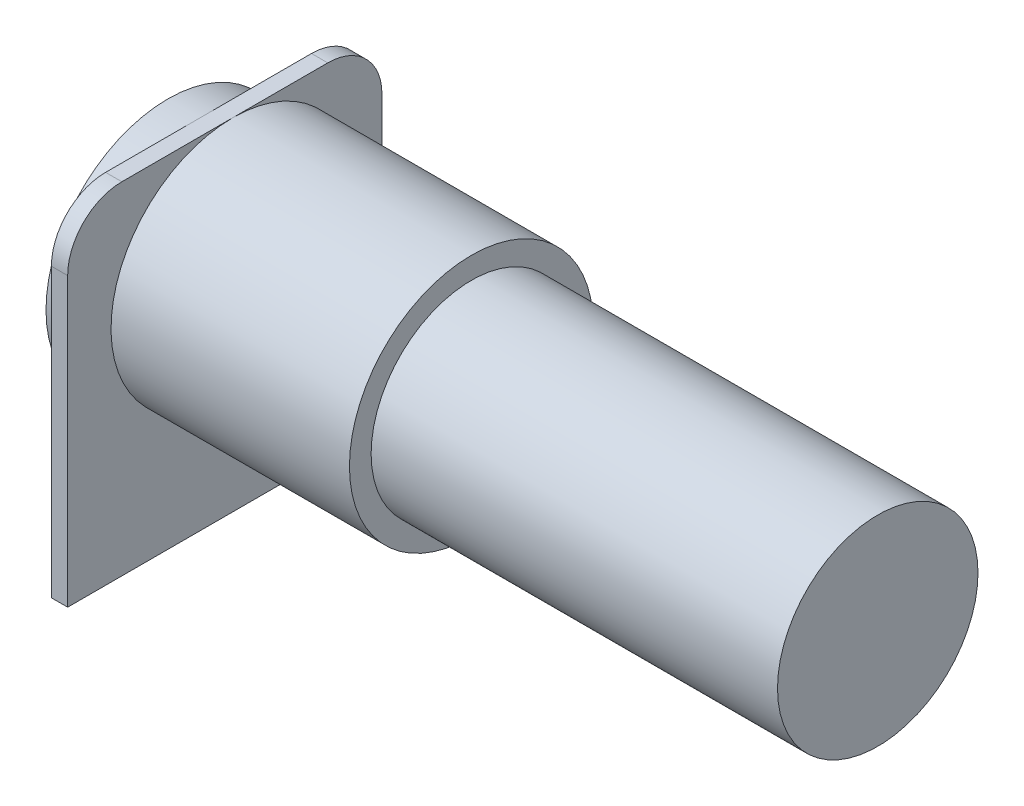
ISO-10303-21;
HEADER;
FILE_DESCRIPTION(('STEP AP214'),'2;1');
FILE_NAME('part.step','',(''),(''),'','','');
FILE_SCHEMA(('AUTOMOTIVE_DESIGN { 1 0 10303 214 1 1 1 1 }'));
ENDSEC;
DATA;
#1=APPLICATION_CONTEXT('core data for automotive mechanical design processes');
#2=APPLICATION_PROTOCOL_DEFINITION('international standard','automotive_design',2000,#1);
#3=PRODUCT_CONTEXT('',#1,'mechanical');
#4=PRODUCT('Part','Part','',(#3));
#5=PRODUCT_RELATED_PRODUCT_CATEGORY('part','',(#4));
#6=PRODUCT_DEFINITION_FORMATION('','',#4);
#7=PRODUCT_DEFINITION_CONTEXT('part definition',#1,'design');
#8=PRODUCT_DEFINITION('design','',#6,#7);
#9=PRODUCT_DEFINITION_SHAPE('','',#8);
#10=(LENGTH_UNIT() NAMED_UNIT(*) SI_UNIT(.MILLI.,.METRE.));
#11=(NAMED_UNIT(*) PLANE_ANGLE_UNIT() SI_UNIT($,.RADIAN.));
#12=(NAMED_UNIT(*) SI_UNIT($,.STERADIAN.) SOLID_ANGLE_UNIT());
#13=UNCERTAINTY_MEASURE_WITH_UNIT(LENGTH_MEASURE(1.E-05),#10,'distance_accuracy_value','');
#14=(GEOMETRIC_REPRESENTATION_CONTEXT(3) GLOBAL_UNCERTAINTY_ASSIGNED_CONTEXT((#13)) GLOBAL_UNIT_ASSIGNED_CONTEXT((#10,
#11,#12)) REPRESENTATION_CONTEXT('',''));
#15=CARTESIAN_POINT('',(0.,0.,0.));
#16=DIRECTION('',(0.,0.,1.));
#17=DIRECTION('',(1.,0.,0.));
#18=AXIS2_PLACEMENT_3D('',#15,#16,#17);
#19=CARTESIAN_POINT('',(3.,-11.2224824355973,58.));
#20=DIRECTION('',(0.,0.,-1.));
#21=DIRECTION('',(0.,1.,0.));
#22=AXIS2_PLACEMENT_3D('',#19,#20,#21);
#23=PLANE('',#22);
#24=DIRECTION('',(0.,-1.,0.));
#25=VECTOR('',#24,1.);
#26=CARTESIAN_POINT('',(0.,-11.2224824355973,58.));
#27=LINE('',#26,#25);
#28=CARTESIAN_POINT('',(0.,-11.2224824355973,58.));
#29=VERTEX_POINT('',#28);
#30=CARTESIAN_POINT('',(0.,-64.2224824355972,58.));
#31=VERTEX_POINT('',#30);
#32=EDGE_CURVE('E140',#29,#31,#27,.T.);
#33=ORIENTED_EDGE('',*,*,#32,.T.);
#34=DIRECTION('',(-1.,0.,0.));
#35=VECTOR('',#34,1.);
#36=CARTESIAN_POINT('',(3.,-64.2224824355972,58.));
#37=LINE('',#36,#35);
#38=CARTESIAN_POINT('',(3.,-64.2224824355972,58.));
#39=VERTEX_POINT('',#38);
#40=EDGE_CURVE('E42',#39,#31,#37,.T.);
#41=ORIENTED_EDGE('',*,*,#40,.F.);
#42=DIRECTION('',(0.,-1.,0.));
#43=VECTOR('',#42,1.);
#44=CARTESIAN_POINT('',(3.,-11.2224824355973,58.));
#45=LINE('',#44,#43);
#46=CARTESIAN_POINT('',(3.,-11.2224824355973,58.));
#47=VERTEX_POINT('',#46);
#48=EDGE_CURVE('E158',#47,#39,#45,.T.);
#49=ORIENTED_EDGE('',*,*,#48,.F.);
#50=DIRECTION('',(-1.,0.,0.));
#51=VECTOR('',#50,1.);
#52=CARTESIAN_POINT('',(3.,-11.2224824355973,58.));
#53=LINE('',#52,#51);
#54=EDGE_CURVE('E136',#47,#29,#53,.T.);
#55=ORIENTED_EDGE('',*,*,#54,.T.);
#56=EDGE_LOOP('',(#33,#41,#49,#55));
#57=FACE_BOUND('',#56,.T.);
#58=ADVANCED_FACE('F39',(#57),#23,.F.);
#59=CARTESIAN_POINT('',(3.,-64.2224824355972,0.));
#60=DIRECTION('',(0.,1.,0.));
#61=DIRECTION('',(0.,0.,1.));
#62=AXIS2_PLACEMENT_3D('',#59,#60,#61);
#63=PLANE('',#62);
#64=DIRECTION('',(0.,0.,-1.));
#65=VECTOR('',#64,1.);
#66=CARTESIAN_POINT('',(0.,-64.2224824355972,0.));
#67=LINE('',#66,#65);
#68=CARTESIAN_POINT('',(0.,-64.2224824355972,0.));
#69=VERTEX_POINT('',#68);
#70=EDGE_CURVE('E144',#31,#69,#67,.T.);
#71=ORIENTED_EDGE('',*,*,#70,.T.);
#72=DIRECTION('',(-1.,0.,0.));
#73=VECTOR('',#72,1.);
#74=CARTESIAN_POINT('',(3.,-64.2224824355972,0.));
#75=LINE('',#74,#73);
#76=CARTESIAN_POINT('',(3.,-64.2224824355972,0.));
#77=VERTEX_POINT('',#76);
#78=EDGE_CURVE('E164',#77,#69,#75,.T.);
#79=ORIENTED_EDGE('',*,*,#78,.F.);
#80=DIRECTION('',(0.,0.,-1.));
#81=VECTOR('',#80,1.);
#82=CARTESIAN_POINT('',(3.,-64.2224824355972,0.));
#83=LINE('',#82,#81);
#84=EDGE_CURVE('E96',#39,#77,#83,.T.);
#85=ORIENTED_EDGE('',*,*,#84,.F.);
#86=ORIENTED_EDGE('',*,*,#40,.T.);
#87=EDGE_LOOP('',(#71,#79,#85,#86));
#88=FACE_BOUND('',#87,.T.);
#89=ADVANCED_FACE('F171',(#88),#63,.F.);
#90=CARTESIAN_POINT('',(3.,-11.2224824355973,0.));
#91=DIRECTION('',(0.,0.,1.));
#92=DIRECTION('',(0.,-1.,0.));
#93=AXIS2_PLACEMENT_3D('',#90,#91,#92);
#94=PLANE('',#93);
#95=DIRECTION('',(0.,1.,0.));
#96=VECTOR('',#95,1.);
#97=CARTESIAN_POINT('',(0.,-11.2224824355973,0.));
#98=LINE('',#97,#96);
#99=CARTESIAN_POINT('',(0.,-11.2224824355973,0.));
#100=VERTEX_POINT('',#99);
#101=EDGE_CURVE('E148',#69,#100,#98,.T.);
#102=ORIENTED_EDGE('',*,*,#101,.T.);
#103=DIRECTION('',(-1.,0.,0.));
#104=VECTOR('',#103,1.);
#105=CARTESIAN_POINT('',(3.,-11.2224824355973,0.));
#106=LINE('',#105,#104);
#107=CARTESIAN_POINT('',(3.,-11.2224824355973,0.));
#108=VERTEX_POINT('',#107);
#109=EDGE_CURVE('E128',#108,#100,#106,.T.);
#110=ORIENTED_EDGE('',*,*,#109,.F.);
#111=DIRECTION('',(0.,1.,0.));
#112=VECTOR('',#111,1.);
#113=CARTESIAN_POINT('',(3.,-11.2224824355973,0.));
#114=LINE('',#113,#112);
#115=EDGE_CURVE('E114',#77,#108,#114,.T.);
#116=ORIENTED_EDGE('',*,*,#115,.F.);
#117=ORIENTED_EDGE('',*,*,#78,.T.);
#118=EDGE_LOOP('',(#102,#110,#116,#117));
#119=FACE_BOUND('',#118,.T.);
#120=ADVANCED_FACE('F177',(#119),#94,.F.);
#121=CARTESIAN_POINT('',(3.,-11.2224824355972,10.));
#122=DIRECTION('',(-1.,0.,0.));
#123=DIRECTION('',(0.,0.,1.));
#124=AXIS2_PLACEMENT_3D('',#121,#122,#123);
#125=CYLINDRICAL_SURFACE('',#124,10.);
#126=CARTESIAN_POINT('',(0.,-11.2224824355972,10.));
#127=DIRECTION('',(1.,0.,0.));
#128=DIRECTION('',(0.,0.,1.));
#129=AXIS2_PLACEMENT_3D('',#126,#127,#128);
#130=CIRCLE('',#129,10.);
#131=CARTESIAN_POINT('',(0.,-1.22248243559719,10.0000000000001));
#132=VERTEX_POINT('',#131);
#133=EDGE_CURVE('E125',#100,#132,#130,.T.);
#134=ORIENTED_EDGE('',*,*,#133,.T.);
#135=DIRECTION('',(-1.,0.,0.));
#136=VECTOR('',#135,1.);
#137=CARTESIAN_POINT('',(3.,-1.22248243559719,10.0000000000001));
#138=LINE('',#137,#136);
#139=CARTESIAN_POINT('',(3.,-1.22248243559719,10.0000000000001));
#140=VERTEX_POINT('',#139);
#141=EDGE_CURVE('E122',#140,#132,#138,.T.);
#142=ORIENTED_EDGE('',*,*,#141,.F.);
#143=CARTESIAN_POINT('',(3.,-11.2224824355972,10.));
#144=DIRECTION('',(1.,0.,0.));
#145=DIRECTION('',(0.,0.,1.));
#146=AXIS2_PLACEMENT_3D('',#143,#144,#145);
#147=CIRCLE('',#146,10.);
#148=EDGE_CURVE('E106',#108,#140,#147,.T.);
#149=ORIENTED_EDGE('',*,*,#148,.F.);
#150=ORIENTED_EDGE('',*,*,#109,.T.);
#151=EDGE_LOOP('',(#134,#142,#149,#150));
#152=FACE_BOUND('',#151,.T.);
#153=ADVANCED_FACE('F123',(#152),#125,.T.);
#154=CARTESIAN_POINT('',(3.,-1.22248243559719,10.0000000000001));
#155=DIRECTION('',(0.,-1.,0.));
#156=DIRECTION('',(0.,0.,-1.));
#157=AXIS2_PLACEMENT_3D('',#154,#155,#156);
#158=PLANE('',#157);
#159=DIRECTION('',(0.,0.,1.));
#160=VECTOR('',#159,1.);
#161=CARTESIAN_POINT('',(0.,-1.22248243559719,10.0000000000001));
#162=LINE('',#161,#160);
#163=CARTESIAN_POINT('',(0.,-1.22248243559719,30.5));
#164=VERTEX_POINT('',#163);
#165=EDGE_CURVE('E153',#132,#164,#162,.T.);
#166=ORIENTED_EDGE('',*,*,#165,.T.);
#167=CARTESIAN_POINT('',(0.,-1.22248243559719,47.9999999999999));
#168=VERTEX_POINT('',#167);
#169=EDGE_CURVE('E81',#164,#168,#162,.T.);
#170=ORIENTED_EDGE('',*,*,#169,.T.);
#171=DIRECTION('',(-1.,0.,0.));
#172=VECTOR('',#171,1.);
#173=CARTESIAN_POINT('',(3.,-1.22248243559719,47.9999999999999));
#174=LINE('',#173,#172);
#175=CARTESIAN_POINT('',(3.,-1.22248243559719,47.9999999999999));
#176=VERTEX_POINT('',#175);
#177=EDGE_CURVE('E129',#176,#168,#174,.T.);
#178=ORIENTED_EDGE('',*,*,#177,.F.);
#179=DIRECTION('',(0.,0.,1.));
#180=VECTOR('',#179,1.);
#181=CARTESIAN_POINT('',(3.,-1.22248243559719,10.0000000000001));
#182=LINE('',#181,#180);
#183=CARTESIAN_POINT('',(3.,-1.22248243559718,27.5));
#184=VERTEX_POINT('',#183);
#185=EDGE_CURVE('E119',#184,#176,#182,.T.);
#186=ORIENTED_EDGE('',*,*,#185,.F.);
#187=EDGE_CURVE('E111',#140,#184,#182,.T.);
#188=ORIENTED_EDGE('',*,*,#187,.F.);
#189=ORIENTED_EDGE('',*,*,#141,.T.);
#190=EDGE_LOOP('',(#166,#170,#178,#186,#188,#189));
#191=FACE_BOUND('',#190,.T.);
#192=ADVANCED_FACE('F131',(#191),#158,.F.);
#193=CARTESIAN_POINT('',(3.,-11.2224824355972,48.));
#194=DIRECTION('',(-1.,0.,0.));
#195=DIRECTION('',(0.,0.,1.));
#196=AXIS2_PLACEMENT_3D('',#193,#194,#195);
#197=CYLINDRICAL_SURFACE('',#196,10.);
#198=CARTESIAN_POINT('',(0.,-11.2224824355972,48.));
#199=DIRECTION('',(1.,0.,0.));
#200=DIRECTION('',(0.,0.,-1.));
#201=AXIS2_PLACEMENT_3D('',#198,#199,#200);
#202=CIRCLE('',#201,10.);
#203=EDGE_CURVE('E87',#168,#29,#202,.T.);
#204=ORIENTED_EDGE('',*,*,#203,.T.);
#205=ORIENTED_EDGE('',*,*,#54,.F.);
#206=CARTESIAN_POINT('',(3.,-11.2224824355972,48.));
#207=DIRECTION('',(1.,0.,0.));
#208=DIRECTION('',(0.,0.,-1.));
#209=AXIS2_PLACEMENT_3D('',#206,#207,#208);
#210=CIRCLE('',#209,10.);
#211=EDGE_CURVE('E57',#176,#47,#210,.T.);
#212=ORIENTED_EDGE('',*,*,#211,.F.);
#213=ORIENTED_EDGE('',*,*,#177,.T.);
#214=EDGE_LOOP('',(#204,#205,#212,#213));
#215=FACE_BOUND('',#214,.T.);
#216=ADVANCED_FACE('F253',(#215),#197,.T.);
#217=CARTESIAN_POINT('',(3.,-11.2224824355972,10.));
#218=DIRECTION('',(-1.,0.,0.));
#219=DIRECTION('',(0.,0.,1.));
#220=AXIS2_PLACEMENT_3D('',#217,#218,#219);
#221=PLANE('',#220);
#222=ORIENTED_EDGE('',*,*,#187,.T.);
#223=CARTESIAN_POINT('',(3.,-23.7224824355972,27.5));
#224=DIRECTION('',(1.,0.,0.));
#225=DIRECTION('',(0.,0.,-1.));
#226=AXIS2_PLACEMENT_3D('',#223,#224,#225);
#227=CIRCLE('',#226,22.5);
#228=EDGE_CURVE('E184',#184,#184,#227,.T.);
#229=ORIENTED_EDGE('',*,*,#228,.F.);
#230=ORIENTED_EDGE('',*,*,#185,.T.);
#231=ORIENTED_EDGE('',*,*,#211,.T.);
#232=ORIENTED_EDGE('',*,*,#48,.T.);
#233=ORIENTED_EDGE('',*,*,#84,.T.);
#234=ORIENTED_EDGE('',*,*,#115,.T.);
#235=ORIENTED_EDGE('',*,*,#148,.T.);
#236=EDGE_LOOP('',(#222,#229,#230,#231,#232,#233,#234,#235));
#237=FACE_BOUND('',#236,.T.);
#238=ADVANCED_FACE('F108',(#237),#221,.F.);
#239=CARTESIAN_POINT('',(0.,-11.2224824355972,10.));
#240=DIRECTION('',(-1.,0.,0.));
#241=DIRECTION('',(0.,0.,1.));
#242=AXIS2_PLACEMENT_3D('',#239,#240,#241);
#243=PLANE('',#242);
#244=ORIENTED_EDGE('',*,*,#169,.F.);
#245=CARTESIAN_POINT('',(0.,-23.7224824355972,30.5));
#246=DIRECTION('',(-1.,0.,0.));
#247=DIRECTION('',(0.,0.,1.));
#248=AXIS2_PLACEMENT_3D('',#245,#246,#247);
#249=CIRCLE('',#248,22.5);
#250=EDGE_CURVE('E196',#164,#164,#249,.T.);
#251=ORIENTED_EDGE('',*,*,#250,.F.);
#252=ORIENTED_EDGE('',*,*,#165,.F.);
#253=ORIENTED_EDGE('',*,*,#133,.F.);
#254=ORIENTED_EDGE('',*,*,#101,.F.);
#255=ORIENTED_EDGE('',*,*,#70,.F.);
#256=ORIENTED_EDGE('',*,*,#32,.F.);
#257=ORIENTED_EDGE('',*,*,#203,.F.);
#258=EDGE_LOOP('',(#244,#251,#252,#253,#254,#255,#256,#257));
#259=FACE_BOUND('',#258,.T.);
#260=ADVANCED_FACE('F176',(#259),#243,.T.);
#261=CARTESIAN_POINT('',(47.,-23.7224824355972,27.5));
#262=DIRECTION('',(-1.,0.,0.));
#263=DIRECTION('',(0.,0.,1.));
#264=AXIS2_PLACEMENT_3D('',#261,#262,#263);
#265=CYLINDRICAL_SURFACE('',#264,22.5);
#266=CARTESIAN_POINT('',(47.,-23.7224824355972,27.5));
#267=DIRECTION('',(1.,0.,0.));
#268=DIRECTION('',(0.,0.,-1.));
#269=AXIS2_PLACEMENT_3D('',#266,#267,#268);
#270=CIRCLE('',#269,22.5);
#271=CARTESIAN_POINT('',(47.,-23.7224824355972,4.99999999999999));
#272=VERTEX_POINT('',#271);
#273=EDGE_CURVE('E145',#272,#272,#270,.T.);
#274=ORIENTED_EDGE('',*,*,#273,.F.);
#275=EDGE_LOOP('',(#274));
#276=FACE_BOUND('',#275,.T.);
#277=ORIENTED_EDGE('',*,*,#228,.T.);
#278=EDGE_LOOP('',(#277));
#279=FACE_BOUND('',#278,.T.);
#280=ADVANCED_FACE('F258',(#276,#279),#265,.T.);
#281=CARTESIAN_POINT('',(47.,-23.7224824355972,27.5));
#282=DIRECTION('',(1.,0.,0.));
#283=DIRECTION('',(0.,0.,-1.));
#284=AXIS2_PLACEMENT_3D('',#281,#282,#283);
#285=PLANE('',#284);
#286=CARTESIAN_POINT('',(47.,-23.7224824355972,27.5));
#287=DIRECTION('',(1.,0.,0.));
#288=DIRECTION('',(0.,0.,-1.));
#289=AXIS2_PLACEMENT_3D('',#286,#287,#288);
#290=CIRCLE('',#289,18.5);
#291=CARTESIAN_POINT('',(47.,-23.7224824355972,8.99999999999999));
#292=VERTEX_POINT('',#291);
#293=EDGE_CURVE('E11',#292,#292,#290,.T.);
#294=ORIENTED_EDGE('',*,*,#293,.F.);
#295=EDGE_LOOP('',(#294));
#296=FACE_BOUND('',#295,.T.);
#297=ORIENTED_EDGE('',*,*,#273,.T.);
#298=EDGE_LOOP('',(#297));
#299=FACE_BOUND('',#298,.T.);
#300=ADVANCED_FACE('F263',(#296,#299),#285,.T.);
#301=CARTESIAN_POINT('',(122.,-23.7224824355972,27.5));
#302=DIRECTION('',(-1.,0.,0.));
#303=DIRECTION('',(0.,0.,1.));
#304=AXIS2_PLACEMENT_3D('',#301,#302,#303);
#305=CYLINDRICAL_SURFACE('',#304,18.5);
#306=CARTESIAN_POINT('',(122.,-23.7224824355972,27.5));
#307=DIRECTION('',(1.,0.,0.));
#308=DIRECTION('',(0.,0.,-1.));
#309=AXIS2_PLACEMENT_3D('',#306,#307,#308);
#310=CIRCLE('',#309,18.5);
#311=CARTESIAN_POINT('',(122.,-23.7224824355972,8.99999999999999));
#312=VERTEX_POINT('',#311);
#313=EDGE_CURVE('E188',#312,#312,#310,.T.);
#314=ORIENTED_EDGE('',*,*,#313,.F.);
#315=EDGE_LOOP('',(#314));
#316=FACE_BOUND('',#315,.T.);
#317=ORIENTED_EDGE('',*,*,#293,.T.);
#318=EDGE_LOOP('',(#317));
#319=FACE_BOUND('',#318,.T.);
#320=ADVANCED_FACE('F237',(#316,#319),#305,.T.);
#321=CARTESIAN_POINT('',(122.,-23.7224824355972,27.5));
#322=DIRECTION('',(1.,0.,0.));
#323=DIRECTION('',(0.,0.,-1.));
#324=AXIS2_PLACEMENT_3D('',#321,#322,#323);
#325=PLANE('',#324);
#326=ORIENTED_EDGE('',*,*,#313,.T.);
#327=EDGE_LOOP('',(#326));
#328=FACE_BOUND('',#327,.T.);
#329=ADVANCED_FACE('F229',(#328),#325,.T.);
#330=CARTESIAN_POINT('',(-6.,-23.7224824355972,30.5));
#331=DIRECTION('',(1.,0.,0.));
#332=DIRECTION('',(0.,0.,-1.));
#333=AXIS2_PLACEMENT_3D('',#330,#331,#332);
#334=CYLINDRICAL_SURFACE('',#333,22.5);
#335=CARTESIAN_POINT('',(-6.,-23.7224824355972,30.5));
#336=DIRECTION('',(-1.,0.,0.));
#337=DIRECTION('',(0.,0.,1.));
#338=AXIS2_PLACEMENT_3D('',#335,#336,#337);
#339=CIRCLE('',#338,22.5);
#340=CARTESIAN_POINT('',(-6.,-23.7224824355972,53.));
#341=VERTEX_POINT('',#340);
#342=EDGE_CURVE('E195',#341,#341,#339,.T.);
#343=ORIENTED_EDGE('',*,*,#342,.F.);
#344=EDGE_LOOP('',(#343));
#345=FACE_BOUND('',#344,.T.);
#346=ORIENTED_EDGE('',*,*,#250,.T.);
#347=EDGE_LOOP('',(#346));
#348=FACE_BOUND('',#347,.T.);
#349=ADVANCED_FACE('F223',(#345,#348),#334,.T.);
#350=CARTESIAN_POINT('',(-6.,-23.7224824355972,30.5));
#351=DIRECTION('',(-1.,0.,0.));
#352=DIRECTION('',(0.,0.,1.));
#353=AXIS2_PLACEMENT_3D('',#350,#351,#352);
#354=PLANE('',#353);
#355=CARTESIAN_POINT('',(-6.,-23.7224824355972,30.5));
#356=DIRECTION('',(-1.,0.,0.));
#357=DIRECTION('',(0.,0.,1.));
#358=AXIS2_PLACEMENT_3D('',#355,#356,#357);
#359=CIRCLE('',#358,3.);
#360=CARTESIAN_POINT('',(-6.,-23.7224824355972,33.5));
#361=VERTEX_POINT('',#360);
#362=EDGE_CURVE('E204',#361,#361,#359,.T.);
#363=ORIENTED_EDGE('',*,*,#362,.F.);
#364=EDGE_LOOP('',(#363));
#365=FACE_BOUND('',#364,.T.);
#366=ORIENTED_EDGE('',*,*,#342,.T.);
#367=EDGE_LOOP('',(#366));
#368=FACE_BOUND('',#367,.T.);
#369=ADVANCED_FACE('F217',(#365,#368),#354,.T.);
#370=CARTESIAN_POINT('',(-13.5,-23.7224824355972,30.5));
#371=DIRECTION('',(1.,0.,0.));
#372=DIRECTION('',(0.,0.,-1.));
#373=AXIS2_PLACEMENT_3D('',#370,#371,#372);
#374=CYLINDRICAL_SURFACE('',#373,3.);
#375=CARTESIAN_POINT('',(-13.5,-23.7224824355972,30.5));
#376=DIRECTION('',(-1.,0.,0.));
#377=DIRECTION('',(0.,0.,1.));
#378=AXIS2_PLACEMENT_3D('',#375,#376,#377);
#379=CIRCLE('',#378,3.);
#380=CARTESIAN_POINT('',(-13.5,-23.7224824355972,33.5));
#381=VERTEX_POINT('',#380);
#382=EDGE_CURVE('E200',#381,#381,#379,.T.);
#383=ORIENTED_EDGE('',*,*,#382,.F.);
#384=EDGE_LOOP('',(#383));
#385=FACE_BOUND('',#384,.T.);
#386=ORIENTED_EDGE('',*,*,#362,.T.);
#387=EDGE_LOOP('',(#386));
#388=FACE_BOUND('',#387,.T.);
#389=ADVANCED_FACE('F214',(#385,#388),#374,.T.);
#390=CARTESIAN_POINT('',(-13.5,-23.7224824355972,30.5));
#391=DIRECTION('',(-1.,0.,0.));
#392=DIRECTION('',(0.,0.,1.));
#393=AXIS2_PLACEMENT_3D('',#390,#391,#392);
#394=PLANE('',#393);
#395=ORIENTED_EDGE('',*,*,#382,.T.);
#396=EDGE_LOOP('',(#395));
#397=FACE_BOUND('',#396,.T.);
#398=ADVANCED_FACE('F212',(#397),#394,.T.);
#399=CLOSED_SHELL('',(#58,#89,#120,#153,#192,#216,#238,#260,#280,#300,#320,#329,#349,#369,#389,#398));
#400=MANIFOLD_SOLID_BREP('B2',#399);
#401=ADVANCED_BREP_SHAPE_REPRESENTATION('',(#18,#400),#14);
#402=SHAPE_DEFINITION_REPRESENTATION(#9,#401);
ENDSEC;
END-ISO-10303-21;
